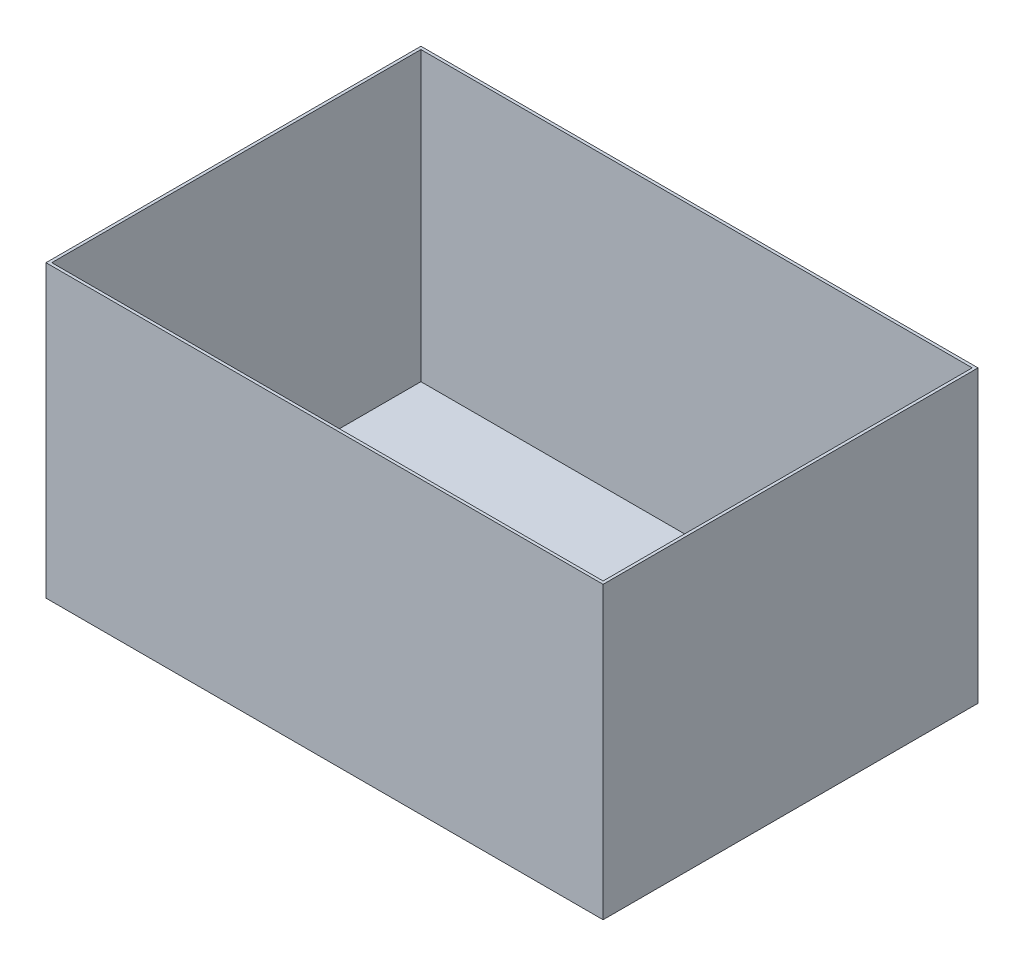
ISO-10303-21;
HEADER;
FILE_DESCRIPTION(('STEP AP214'),'2;1');
FILE_NAME('part.step','',(''),(''),'','','');
FILE_SCHEMA(('AUTOMOTIVE_DESIGN { 1 0 10303 214 1 1 1 1 }'));
ENDSEC;
DATA;
#1=APPLICATION_CONTEXT('core data for automotive mechanical design processes');
#2=APPLICATION_PROTOCOL_DEFINITION('international standard','automotive_design',2000,#1);
#3=PRODUCT_CONTEXT('',#1,'mechanical');
#4=PRODUCT('Part','Part','',(#3));
#5=PRODUCT_RELATED_PRODUCT_CATEGORY('part','',(#4));
#6=PRODUCT_DEFINITION_FORMATION('','',#4);
#7=PRODUCT_DEFINITION_CONTEXT('part definition',#1,'design');
#8=PRODUCT_DEFINITION('design','',#6,#7);
#9=PRODUCT_DEFINITION_SHAPE('','',#8);
#10=(LENGTH_UNIT() NAMED_UNIT(*) SI_UNIT(.MILLI.,.METRE.));
#11=(NAMED_UNIT(*) PLANE_ANGLE_UNIT() SI_UNIT($,.RADIAN.));
#12=(NAMED_UNIT(*) SI_UNIT($,.STERADIAN.) SOLID_ANGLE_UNIT());
#13=UNCERTAINTY_MEASURE_WITH_UNIT(LENGTH_MEASURE(1.E-05),#10,'distance_accuracy_value','');
#14=(GEOMETRIC_REPRESENTATION_CONTEXT(3) GLOBAL_UNCERTAINTY_ASSIGNED_CONTEXT((#13)) GLOBAL_UNIT_ASSIGNED_CONTEXT((#10,
#11,#12)) REPRESENTATION_CONTEXT('',''));
#15=CARTESIAN_POINT('',(0.,0.,0.));
#16=DIRECTION('',(0.,0.,1.));
#17=DIRECTION('',(1.,0.,0.));
#18=AXIS2_PLACEMENT_3D('',#15,#16,#17);
#19=CARTESIAN_POINT('',(290.5,151.5,-195.5));
#20=DIRECTION('',(-1.,0.,0.));
#21=DIRECTION('',(0.,0.,1.));
#22=AXIS2_PLACEMENT_3D('',#19,#20,#21);
#23=PLANE('',#22);
#24=DIRECTION('',(0.,0.,-1.));
#25=VECTOR('',#24,1.);
#26=CARTESIAN_POINT('',(290.5,-151.5,-195.5));
#27=LINE('',#26,#25);
#28=CARTESIAN_POINT('',(290.5,-151.5,195.5));
#29=VERTEX_POINT('',#28);
#30=CARTESIAN_POINT('',(290.5,-151.5,-195.5));
#31=VERTEX_POINT('',#30);
#32=EDGE_CURVE('E147',#29,#31,#27,.T.);
#33=ORIENTED_EDGE('',*,*,#32,.T.);
#34=DIRECTION('',(0.,-1.,0.));
#35=VECTOR('',#34,1.);
#36=CARTESIAN_POINT('',(290.5,151.5,-195.5));
#37=LINE('',#36,#35);
#38=CARTESIAN_POINT('',(290.5,151.5,-195.5));
#39=VERTEX_POINT('',#38);
#40=EDGE_CURVE('E11',#39,#31,#37,.T.);
#41=ORIENTED_EDGE('',*,*,#40,.F.);
#42=DIRECTION('',(0.,0.,-1.));
#43=VECTOR('',#42,1.);
#44=CARTESIAN_POINT('',(290.5,151.5,-195.5));
#45=LINE('',#44,#43);
#46=CARTESIAN_POINT('',(290.5,151.5,195.5));
#47=VERTEX_POINT('',#46);
#48=EDGE_CURVE('E140',#47,#39,#45,.T.);
#49=ORIENTED_EDGE('',*,*,#48,.F.);
#50=DIRECTION('',(0.,-1.,0.));
#51=VECTOR('',#50,1.);
#52=CARTESIAN_POINT('',(290.5,151.5,195.5));
#53=LINE('',#52,#51);
#54=EDGE_CURVE('E146',#47,#29,#53,.T.);
#55=ORIENTED_EDGE('',*,*,#54,.T.);
#56=EDGE_LOOP('',(#33,#41,#49,#55));
#57=FACE_BOUND('',#56,.T.);
#58=ADVANCED_FACE('F33',(#57),#23,.F.);
#59=CARTESIAN_POINT('',(-290.5,151.5,-195.5));
#60=DIRECTION('',(0.,0.,1.));
#61=DIRECTION('',(1.,0.,0.));
#62=AXIS2_PLACEMENT_3D('',#59,#60,#61);
#63=PLANE('',#62);
#64=DIRECTION('',(-1.,0.,0.));
#65=VECTOR('',#64,1.);
#66=CARTESIAN_POINT('',(-290.5,-151.5,-195.5));
#67=LINE('',#66,#65);
#68=CARTESIAN_POINT('',(-290.5,-151.5,-195.5));
#69=VERTEX_POINT('',#68);
#70=EDGE_CURVE('E150',#31,#69,#67,.T.);
#71=ORIENTED_EDGE('',*,*,#70,.T.);
#72=DIRECTION('',(0.,-1.,0.));
#73=VECTOR('',#72,1.);
#74=CARTESIAN_POINT('',(-290.5,151.5,-195.5));
#75=LINE('',#74,#73);
#76=CARTESIAN_POINT('',(-290.5,151.5,-195.5));
#77=VERTEX_POINT('',#76);
#78=EDGE_CURVE('E40',#77,#69,#75,.T.);
#79=ORIENTED_EDGE('',*,*,#78,.F.);
#80=DIRECTION('',(-1.,0.,0.));
#81=VECTOR('',#80,1.);
#82=CARTESIAN_POINT('',(-290.5,151.5,-195.5));
#83=LINE('',#82,#81);
#84=EDGE_CURVE('E84',#39,#77,#83,.T.);
#85=ORIENTED_EDGE('',*,*,#84,.F.);
#86=ORIENTED_EDGE('',*,*,#40,.T.);
#87=EDGE_LOOP('',(#71,#79,#85,#86));
#88=FACE_BOUND('',#87,.T.);
#89=ADVANCED_FACE('F179',(#88),#63,.F.);
#90=CARTESIAN_POINT('',(-290.5,151.5,-195.5));
#91=DIRECTION('',(1.,0.,0.));
#92=DIRECTION('',(0.,0.,-1.));
#93=AXIS2_PLACEMENT_3D('',#90,#91,#92);
#94=PLANE('',#93);
#95=DIRECTION('',(0.,0.,1.));
#96=VECTOR('',#95,1.);
#97=CARTESIAN_POINT('',(-290.5,-151.5,-195.5));
#98=LINE('',#97,#96);
#99=CARTESIAN_POINT('',(-290.5,-151.5,195.5));
#100=VERTEX_POINT('',#99);
#101=EDGE_CURVE('E152',#69,#100,#98,.T.);
#102=ORIENTED_EDGE('',*,*,#101,.T.);
#103=DIRECTION('',(0.,-1.,0.));
#104=VECTOR('',#103,1.);
#105=CARTESIAN_POINT('',(-290.5,151.5,195.5));
#106=LINE('',#105,#104);
#107=CARTESIAN_POINT('',(-290.5,151.5,195.5));
#108=VERTEX_POINT('',#107);
#109=EDGE_CURVE('E156',#108,#100,#106,.T.);
#110=ORIENTED_EDGE('',*,*,#109,.F.);
#111=DIRECTION('',(0.,0.,1.));
#112=VECTOR('',#111,1.);
#113=CARTESIAN_POINT('',(-290.5,151.5,-195.5));
#114=LINE('',#113,#112);
#115=EDGE_CURVE('E143',#77,#108,#114,.T.);
#116=ORIENTED_EDGE('',*,*,#115,.F.);
#117=ORIENTED_EDGE('',*,*,#78,.T.);
#118=EDGE_LOOP('',(#102,#110,#116,#117));
#119=FACE_BOUND('',#118,.T.);
#120=ADVANCED_FACE('F161',(#119),#94,.F.);
#121=CARTESIAN_POINT('',(-290.5,151.5,195.5));
#122=DIRECTION('',(0.,0.,-1.));
#123=DIRECTION('',(-1.,0.,0.));
#124=AXIS2_PLACEMENT_3D('',#121,#122,#123);
#125=PLANE('',#124);
#126=DIRECTION('',(1.,0.,0.));
#127=VECTOR('',#126,1.);
#128=CARTESIAN_POINT('',(-290.5,-151.5,195.5));
#129=LINE('',#128,#127);
#130=EDGE_CURVE('E77',#100,#29,#129,.T.);
#131=ORIENTED_EDGE('',*,*,#130,.T.);
#132=ORIENTED_EDGE('',*,*,#54,.F.);
#133=DIRECTION('',(1.,0.,0.));
#134=VECTOR('',#133,1.);
#135=CARTESIAN_POINT('',(-290.5,151.5,195.5));
#136=LINE('',#135,#134);
#137=EDGE_CURVE('E56',#108,#47,#136,.T.);
#138=ORIENTED_EDGE('',*,*,#137,.F.);
#139=ORIENTED_EDGE('',*,*,#109,.T.);
#140=EDGE_LOOP('',(#131,#132,#138,#139));
#141=FACE_BOUND('',#140,.T.);
#142=ADVANCED_FACE('F169',(#141),#125,.F.);
#143=CARTESIAN_POINT('',(0.,151.5,0.));
#144=DIRECTION('',(0.,1.,0.));
#145=DIRECTION('',(0.,0.,1.));
#146=AXIS2_PLACEMENT_3D('',#143,#144,#145);
#147=PLANE('',#146);
#148=DIRECTION('',(0.,0.,-1.));
#149=VECTOR('',#148,1.);
#150=CARTESIAN_POINT('',(287.5,151.5,-195.5));
#151=LINE('',#150,#149);
#152=CARTESIAN_POINT('',(287.5,151.5,192.5));
#153=VERTEX_POINT('',#152);
#154=CARTESIAN_POINT('',(287.5,151.5,-192.5));
#155=VERTEX_POINT('',#154);
#156=EDGE_CURVE('E129',#153,#155,#151,.T.);
#157=ORIENTED_EDGE('',*,*,#156,.F.);
#158=DIRECTION('',(1.,0.,0.));
#159=VECTOR('',#158,1.);
#160=CARTESIAN_POINT('',(-290.5,151.5,192.5));
#161=LINE('',#160,#159);
#162=CARTESIAN_POINT('',(-287.5,151.5,192.5));
#163=VERTEX_POINT('',#162);
#164=EDGE_CURVE('E138',#163,#153,#161,.T.);
#165=ORIENTED_EDGE('',*,*,#164,.F.);
#166=DIRECTION('',(0.,0.,1.));
#167=VECTOR('',#166,1.);
#168=CARTESIAN_POINT('',(-287.5,151.5,-195.5));
#169=LINE('',#168,#167);
#170=CARTESIAN_POINT('',(-287.5,151.5,-192.5));
#171=VERTEX_POINT('',#170);
#172=EDGE_CURVE('E136',#171,#163,#169,.T.);
#173=ORIENTED_EDGE('',*,*,#172,.F.);
#174=DIRECTION('',(-1.,0.,0.));
#175=VECTOR('',#174,1.);
#176=CARTESIAN_POINT('',(-290.5,151.5,-192.5));
#177=LINE('',#176,#175);
#178=EDGE_CURVE('E121',#155,#171,#177,.T.);
#179=ORIENTED_EDGE('',*,*,#178,.F.);
#180=EDGE_LOOP('',(#157,#165,#173,#179));
#181=FACE_BOUND('',#180,.T.);
#182=ORIENTED_EDGE('',*,*,#48,.T.);
#183=ORIENTED_EDGE('',*,*,#84,.T.);
#184=ORIENTED_EDGE('',*,*,#115,.T.);
#185=ORIENTED_EDGE('',*,*,#137,.T.);
#186=EDGE_LOOP('',(#182,#183,#184,#185));
#187=FACE_BOUND('',#186,.T.);
#188=ADVANCED_FACE('F171',(#181,#187),#147,.T.);
#189=CARTESIAN_POINT('',(0.,-151.5,0.));
#190=DIRECTION('',(0.,1.,0.));
#191=DIRECTION('',(0.,0.,1.));
#192=AXIS2_PLACEMENT_3D('',#189,#190,#191);
#193=PLANE('',#192);
#194=ORIENTED_EDGE('',*,*,#32,.F.);
#195=ORIENTED_EDGE('',*,*,#130,.F.);
#196=ORIENTED_EDGE('',*,*,#101,.F.);
#197=ORIENTED_EDGE('',*,*,#70,.F.);
#198=EDGE_LOOP('',(#194,#195,#196,#197));
#199=FACE_BOUND('',#198,.T.);
#200=ADVANCED_FACE('F165',(#199),#193,.F.);
#201=CARTESIAN_POINT('',(287.5,151.5,-195.5));
#202=DIRECTION('',(-1.,0.,0.));
#203=DIRECTION('',(0.,0.,1.));
#204=AXIS2_PLACEMENT_3D('',#201,#202,#203);
#205=PLANE('',#204);
#206=DIRECTION('',(0.,0.,-1.));
#207=VECTOR('',#206,1.);
#208=CARTESIAN_POINT('',(287.5,-148.5,-195.5));
#209=LINE('',#208,#207);
#210=CARTESIAN_POINT('',(287.5,-148.5,192.5));
#211=VERTEX_POINT('',#210);
#212=CARTESIAN_POINT('',(287.5,-148.5,-192.5));
#213=VERTEX_POINT('',#212);
#214=EDGE_CURVE('E112',#211,#213,#209,.T.);
#215=ORIENTED_EDGE('',*,*,#214,.F.);
#216=DIRECTION('',(0.,-1.,0.));
#217=VECTOR('',#216,1.);
#218=CARTESIAN_POINT('',(287.5,151.5,192.5));
#219=LINE('',#218,#217);
#220=EDGE_CURVE('E132',#153,#211,#219,.T.);
#221=ORIENTED_EDGE('',*,*,#220,.F.);
#222=ORIENTED_EDGE('',*,*,#156,.T.);
#223=DIRECTION('',(0.,-1.,0.));
#224=VECTOR('',#223,1.);
#225=CARTESIAN_POINT('',(287.5,151.5,-192.5));
#226=LINE('',#225,#224);
#227=EDGE_CURVE('E124',#155,#213,#226,.T.);
#228=ORIENTED_EDGE('',*,*,#227,.T.);
#229=EDGE_LOOP('',(#215,#221,#222,#228));
#230=FACE_BOUND('',#229,.T.);
#231=ADVANCED_FACE('F206',(#230),#205,.T.);
#232=CARTESIAN_POINT('',(-290.5,151.5,-192.5));
#233=DIRECTION('',(0.,0.,1.));
#234=DIRECTION('',(1.,0.,0.));
#235=AXIS2_PLACEMENT_3D('',#232,#233,#234);
#236=PLANE('',#235);
#237=DIRECTION('',(-1.,0.,0.));
#238=VECTOR('',#237,1.);
#239=CARTESIAN_POINT('',(-290.5,-148.5,-192.5));
#240=LINE('',#239,#238);
#241=CARTESIAN_POINT('',(-287.5,-148.5,-192.5));
#242=VERTEX_POINT('',#241);
#243=EDGE_CURVE('E106',#213,#242,#240,.T.);
#244=ORIENTED_EDGE('',*,*,#243,.F.);
#245=ORIENTED_EDGE('',*,*,#227,.F.);
#246=ORIENTED_EDGE('',*,*,#178,.T.);
#247=DIRECTION('',(0.,-1.,0.));
#248=VECTOR('',#247,1.);
#249=CARTESIAN_POINT('',(-287.5,151.5,-192.5));
#250=LINE('',#249,#248);
#251=EDGE_CURVE('E118',#171,#242,#250,.T.);
#252=ORIENTED_EDGE('',*,*,#251,.T.);
#253=EDGE_LOOP('',(#244,#245,#246,#252));
#254=FACE_BOUND('',#253,.T.);
#255=ADVANCED_FACE('F119',(#254),#236,.T.);
#256=CARTESIAN_POINT('',(-287.5,151.5,-195.5));
#257=DIRECTION('',(1.,0.,0.));
#258=DIRECTION('',(0.,0.,-1.));
#259=AXIS2_PLACEMENT_3D('',#256,#257,#258);
#260=PLANE('',#259);
#261=DIRECTION('',(0.,0.,1.));
#262=VECTOR('',#261,1.);
#263=CARTESIAN_POINT('',(-287.5,-148.5,-195.5));
#264=LINE('',#263,#262);
#265=CARTESIAN_POINT('',(-287.5,-148.5,192.5));
#266=VERTEX_POINT('',#265);
#267=EDGE_CURVE('E110',#242,#266,#264,.T.);
#268=ORIENTED_EDGE('',*,*,#267,.F.);
#269=ORIENTED_EDGE('',*,*,#251,.F.);
#270=ORIENTED_EDGE('',*,*,#172,.T.);
#271=DIRECTION('',(0.,-1.,0.));
#272=VECTOR('',#271,1.);
#273=CARTESIAN_POINT('',(-287.5,151.5,192.5));
#274=LINE('',#273,#272);
#275=EDGE_CURVE('E47',#163,#266,#274,.T.);
#276=ORIENTED_EDGE('',*,*,#275,.T.);
#277=EDGE_LOOP('',(#268,#269,#270,#276));
#278=FACE_BOUND('',#277,.T.);
#279=ADVANCED_FACE('F126',(#278),#260,.T.);
#280=CARTESIAN_POINT('',(-290.5,151.5,192.5));
#281=DIRECTION('',(0.,0.,-1.));
#282=DIRECTION('',(-1.,0.,0.));
#283=AXIS2_PLACEMENT_3D('',#280,#281,#282);
#284=PLANE('',#283);
#285=DIRECTION('',(1.,0.,0.));
#286=VECTOR('',#285,1.);
#287=CARTESIAN_POINT('',(-290.5,-148.5,192.5));
#288=LINE('',#287,#286);
#289=EDGE_CURVE('E127',#266,#211,#288,.T.);
#290=ORIENTED_EDGE('',*,*,#289,.F.);
#291=ORIENTED_EDGE('',*,*,#275,.F.);
#292=ORIENTED_EDGE('',*,*,#164,.T.);
#293=ORIENTED_EDGE('',*,*,#220,.T.);
#294=EDGE_LOOP('',(#290,#291,#292,#293));
#295=FACE_BOUND('',#294,.T.);
#296=ADVANCED_FACE('F236',(#295),#284,.T.);
#297=CARTESIAN_POINT('',(0.,-148.5,0.));
#298=DIRECTION('',(0.,1.,0.));
#299=DIRECTION('',(0.,0.,1.));
#300=AXIS2_PLACEMENT_3D('',#297,#298,#299);
#301=PLANE('',#300);
#302=ORIENTED_EDGE('',*,*,#214,.T.);
#303=ORIENTED_EDGE('',*,*,#243,.T.);
#304=ORIENTED_EDGE('',*,*,#267,.T.);
#305=ORIENTED_EDGE('',*,*,#289,.T.);
#306=EDGE_LOOP('',(#302,#303,#304,#305));
#307=FACE_BOUND('',#306,.T.);
#308=ADVANCED_FACE('F108',(#307),#301,.T.);
#309=CLOSED_SHELL('',(#58,#89,#120,#142,#188,#200,#231,#255,#279,#296,#308));
#310=MANIFOLD_SOLID_BREP('B2',#309);
#311=ADVANCED_BREP_SHAPE_REPRESENTATION('',(#18,#310),#14);
#312=SHAPE_DEFINITION_REPRESENTATION(#9,#311);
ENDSEC;
END-ISO-10303-21;
